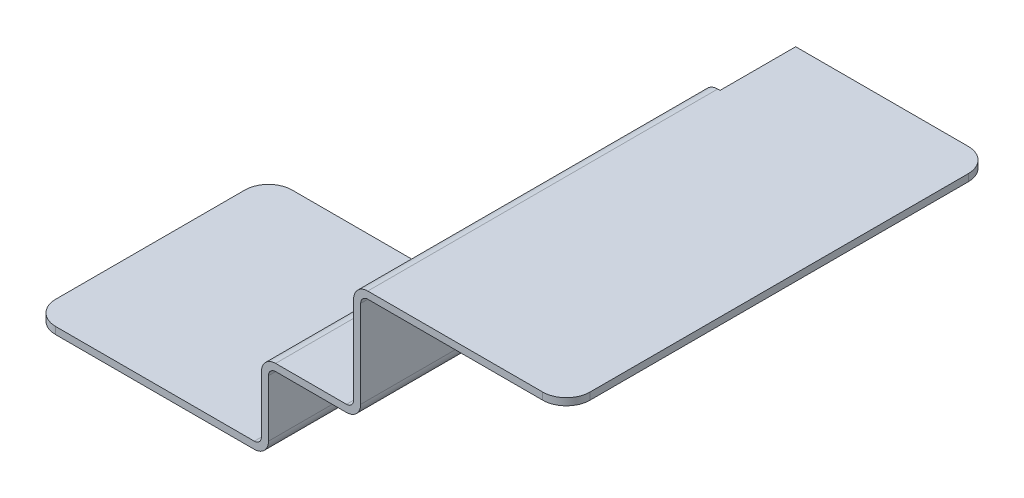
ISO-10303-21;
HEADER;
FILE_DESCRIPTION(('STEP AP214'),'2;1');
FILE_NAME('part.step','',(''),(''),'','','');
FILE_SCHEMA(('AUTOMOTIVE_DESIGN { 1 0 10303 214 1 1 1 1 }'));
ENDSEC;
DATA;
#1=APPLICATION_CONTEXT('core data for automotive mechanical design processes');
#2=APPLICATION_PROTOCOL_DEFINITION('international standard','automotive_design',2000,#1);
#3=PRODUCT_CONTEXT('',#1,'mechanical');
#4=PRODUCT('Part','Part','',(#3));
#5=PRODUCT_RELATED_PRODUCT_CATEGORY('part','',(#4));
#6=PRODUCT_DEFINITION_FORMATION('','',#4);
#7=PRODUCT_DEFINITION_CONTEXT('part definition',#1,'design');
#8=PRODUCT_DEFINITION('design','',#6,#7);
#9=PRODUCT_DEFINITION_SHAPE('','',#8);
#10=(LENGTH_UNIT() NAMED_UNIT(*) SI_UNIT(.MILLI.,.METRE.));
#11=(NAMED_UNIT(*) PLANE_ANGLE_UNIT() SI_UNIT($,.RADIAN.));
#12=(NAMED_UNIT(*) SI_UNIT($,.STERADIAN.) SOLID_ANGLE_UNIT());
#13=UNCERTAINTY_MEASURE_WITH_UNIT(LENGTH_MEASURE(1.E-05),#10,'distance_accuracy_value','');
#14=(GEOMETRIC_REPRESENTATION_CONTEXT(3) GLOBAL_UNCERTAINTY_ASSIGNED_CONTEXT((#13)) GLOBAL_UNIT_ASSIGNED_CONTEXT((#10,
#11,#12)) REPRESENTATION_CONTEXT('',''));
#15=CARTESIAN_POINT('',(0.,0.,0.));
#16=DIRECTION('',(0.,0.,1.));
#17=DIRECTION('',(1.,0.,0.));
#18=AXIS2_PLACEMENT_3D('',#15,#16,#17);
#19=CARTESIAN_POINT('',(50.,14.,16.));
#20=DIRECTION('',(0.,1.,0.));
#21=DIRECTION('',(0.,0.,1.));
#22=AXIS2_PLACEMENT_3D('',#19,#20,#21);
#23=PLANE('',#22);
#24=DIRECTION('',(0.,0.,-1.));
#25=VECTOR('',#24,1.);
#26=CARTESIAN_POINT('',(50.,14.,0.));
#27=LINE('',#26,#25);
#28=CARTESIAN_POINT('',(50.,14.,40.));
#29=VERTEX_POINT('',#28);
#30=CARTESIAN_POINT('',(50.,14.,16.));
#31=VERTEX_POINT('',#30);
#32=EDGE_CURVE('E309',#29,#31,#27,.T.);
#33=ORIENTED_EDGE('',*,*,#32,.F.);
#34=DIRECTION('',(1.,0.,0.));
#35=VECTOR('',#34,1.);
#36=CARTESIAN_POINT('',(25.2343965753023,14.,40.));
#37=LINE('',#36,#35);
#38=CARTESIAN_POINT('',(48.5,14.,40.));
#39=VERTEX_POINT('',#38);
#40=EDGE_CURVE('E196',#29,#39,#37,.F.);
#41=ORIENTED_EDGE('',*,*,#40,.T.);
#42=DIRECTION('',(0.,0.,1.));
#43=VECTOR('',#42,1.);
#44=CARTESIAN_POINT('',(48.5,14.,0.));
#45=LINE('',#44,#43);
#46=CARTESIAN_POINT('',(48.5,14.,16.));
#47=VERTEX_POINT('',#46);
#48=EDGE_CURVE('E272',#47,#39,#45,.T.);
#49=ORIENTED_EDGE('',*,*,#48,.F.);
#50=DIRECTION('',(1.,0.,0.));
#51=VECTOR('',#50,1.);
#52=CARTESIAN_POINT('',(48.5,14.,16.));
#53=LINE('',#52,#51);
#54=EDGE_CURVE('E207',#47,#31,#53,.T.);
#55=ORIENTED_EDGE('',*,*,#54,.T.);
#56=EDGE_LOOP('',(#33,#41,#49,#55));
#57=FACE_BOUND('',#56,.T.);
#58=ADVANCED_FACE('F17',(#57),#23,.F.);
#59=CARTESIAN_POINT('',(46.,7.5,60.));
#60=DIRECTION('',(1.,0.,0.));
#61=DIRECTION('',(0.,0.,-1.));
#62=AXIS2_PLACEMENT_3D('',#59,#60,#61);
#63=CYLINDRICAL_SURFACE('',#62,1.6);
#64=CARTESIAN_POINT('',(50.,7.5,60.));
#65=DIRECTION('',(1.,0.,0.));
#66=DIRECTION('',(0.,0.,-1.));
#67=AXIS2_PLACEMENT_3D('',#64,#65,#66);
#68=CIRCLE('',#67,1.6);
#69=CARTESIAN_POINT('',(50.,7.5,58.4));
#70=VERTEX_POINT('',#69);
#71=EDGE_CURVE('E302',#70,#70,#68,.F.);
#72=ORIENTED_EDGE('',*,*,#71,.F.);
#73=EDGE_LOOP('',(#72));
#74=FACE_BOUND('',#73,.T.);
#75=CARTESIAN_POINT('',(48.5,7.5,60.));
#76=DIRECTION('',(1.,0.,0.));
#77=DIRECTION('',(0.,0.,-1.));
#78=AXIS2_PLACEMENT_3D('',#75,#76,#77);
#79=CIRCLE('',#78,1.6);
#80=CARTESIAN_POINT('',(48.5,7.5,58.4));
#81=VERTEX_POINT('',#80);
#82=EDGE_CURVE('E263',#81,#81,#79,.T.);
#83=ORIENTED_EDGE('',*,*,#82,.F.);
#84=EDGE_LOOP('',(#83));
#85=FACE_BOUND('',#84,.T.);
#86=ADVANCED_FACE('F759',(#74,#85),#63,.F.);
#87=CARTESIAN_POINT('',(5.,9.72362012987013,85.));
#88=DIRECTION('',(0.,1.,0.));
#89=DIRECTION('',(-1.,0.,0.));
#90=AXIS2_PLACEMENT_3D('',#87,#88,#89);
#91=CYLINDRICAL_SURFACE('',#90,5.);
#92=CARTESIAN_POINT('',(5.,0.,85.));
#93=DIRECTION('',(0.,1.,0.));
#94=DIRECTION('',(-1.,0.,0.));
#95=AXIS2_PLACEMENT_3D('',#92,#93,#94);
#96=CIRCLE('',#95,5.);
#97=CARTESIAN_POINT('',(5.,0.,90.));
#98=VERTEX_POINT('',#97);
#99=CARTESIAN_POINT('',(0.,0.,85.));
#100=VERTEX_POINT('',#99);
#101=EDGE_CURVE('E20',#98,#100,#96,.F.);
#102=ORIENTED_EDGE('',*,*,#101,.F.);
#103=DIRECTION('',(0.,1.,0.));
#104=VECTOR('',#103,1.);
#105=CARTESIAN_POINT('',(5.,9.72362012987013,90.));
#106=LINE('',#105,#104);
#107=CARTESIAN_POINT('',(5.,1.5,90.));
#108=VERTEX_POINT('',#107);
#109=EDGE_CURVE('E185',#98,#108,#106,.T.);
#110=ORIENTED_EDGE('',*,*,#109,.T.);
#111=CARTESIAN_POINT('',(5.,1.5,85.));
#112=DIRECTION('',(0.,1.,0.));
#113=DIRECTION('',(-1.,0.,0.));
#114=AXIS2_PLACEMENT_3D('',#111,#112,#113);
#115=CIRCLE('',#114,5.);
#116=CARTESIAN_POINT('',(0.,1.5,85.));
#117=VERTEX_POINT('',#116);
#118=EDGE_CURVE('E259',#117,#108,#115,.T.);
#119=ORIENTED_EDGE('',*,*,#118,.F.);
#120=DIRECTION('',(0.,1.,0.));
#121=VECTOR('',#120,1.);
#122=CARTESIAN_POINT('',(0.,0.,85.));
#123=LINE('',#122,#121);
#124=EDGE_CURVE('E202',#100,#117,#123,.T.);
#125=ORIENTED_EDGE('',*,*,#124,.F.);
#126=EDGE_LOOP('',(#102,#110,#119,#125));
#127=FACE_BOUND('',#126,.T.);
#128=ADVANCED_FACE('F200',(#127),#91,.T.);
#129=CARTESIAN_POINT('',(25.2343965753023,0.829465188471263,40.));
#130=DIRECTION('',(0.,0.,1.));
#131=DIRECTION('',(1.,0.,0.));
#132=AXIS2_PLACEMENT_3D('',#129,#130,#131);
#133=PLANE('',#132);
#134=DIRECTION('',(1.,0.,0.));
#135=VECTOR('',#134,1.);
#136=CARTESIAN_POINT('',(0.,1.5,40.));
#137=LINE('',#136,#135);
#138=CARTESIAN_POINT('',(47.,1.5,40.));
#139=VERTEX_POINT('',#138);
#140=CARTESIAN_POINT('',(5.,1.5,40.));
#141=VERTEX_POINT('',#140);
#142=EDGE_CURVE('E253',#139,#141,#137,.F.);
#143=ORIENTED_EDGE('',*,*,#142,.F.);
#144=CARTESIAN_POINT('',(47.,3.,40.));
#145=DIRECTION('',(0.,0.,1.));
#146=DIRECTION('',(1.,0.,0.));
#147=AXIS2_PLACEMENT_3D('',#144,#145,#146);
#148=CIRCLE('',#147,1.5);
#149=CARTESIAN_POINT('',(48.5,3.,40.));
#150=VERTEX_POINT('',#149);
#151=EDGE_CURVE('E262',#139,#150,#148,.T.);
#152=ORIENTED_EDGE('',*,*,#151,.T.);
#153=DIRECTION('',(0.,1.,0.));
#154=VECTOR('',#153,1.);
#155=CARTESIAN_POINT('',(48.5,1.50000000000001,40.));
#156=LINE('',#155,#154);
#157=EDGE_CURVE('E268',#39,#150,#156,.F.);
#158=ORIENTED_EDGE('',*,*,#157,.F.);
#159=ORIENTED_EDGE('',*,*,#40,.F.);
#160=DIRECTION('',(0.,1.,0.));
#161=VECTOR('',#160,1.);
#162=CARTESIAN_POINT('',(50.,16.5,40.));
#163=LINE('',#162,#161);
#164=CARTESIAN_POINT('',(50.,3.,40.));
#165=VERTEX_POINT('',#164);
#166=EDGE_CURVE('E306',#165,#29,#163,.T.);
#167=ORIENTED_EDGE('',*,*,#166,.F.);
#168=CARTESIAN_POINT('',(47.,3.,40.));
#169=DIRECTION('',(0.,0.,1.));
#170=DIRECTION('',(1.,0.,0.));
#171=AXIS2_PLACEMENT_3D('',#168,#169,#170);
#172=CIRCLE('',#171,3.);
#173=CARTESIAN_POINT('',(47.,0.,40.));
#174=VERTEX_POINT('',#173);
#175=EDGE_CURVE('E310',#174,#165,#172,.T.);
#176=ORIENTED_EDGE('',*,*,#175,.F.);
#177=DIRECTION('',(1.,0.,0.));
#178=VECTOR('',#177,1.);
#179=CARTESIAN_POINT('',(50.,0.,40.));
#180=LINE('',#179,#178);
#181=CARTESIAN_POINT('',(5.,0.,40.));
#182=VERTEX_POINT('',#181);
#183=EDGE_CURVE('E311',#182,#174,#180,.T.);
#184=ORIENTED_EDGE('',*,*,#183,.F.);
#185=DIRECTION('',(0.,-1.,0.));
#186=VECTOR('',#185,1.);
#187=CARTESIAN_POINT('',(5.,0.414732594235629,40.));
#188=LINE('',#187,#186);
#189=EDGE_CURVE('E327',#141,#182,#188,.T.);
#190=ORIENTED_EDGE('',*,*,#189,.F.);
#191=EDGE_LOOP('',(#143,#152,#158,#159,#167,#176,#184,#190));
#192=FACE_BOUND('',#191,.T.);
#193=ADVANCED_FACE('F429',(#192),#133,.F.);
#194=CARTESIAN_POINT('',(5.,0.414732594235629,45.));
#195=DIRECTION('',(0.,-1.,0.));
#196=DIRECTION('',(1.,0.,0.));
#197=AXIS2_PLACEMENT_3D('',#194,#195,#196);
#198=CYLINDRICAL_SURFACE('',#197,5.);
#199=CARTESIAN_POINT('',(5.,1.5,45.));
#200=DIRECTION('',(0.,-1.,0.));
#201=DIRECTION('',(1.,0.,0.));
#202=AXIS2_PLACEMENT_3D('',#199,#200,#201);
#203=CIRCLE('',#202,5.);
#204=CARTESIAN_POINT('',(0.,1.5,45.));
#205=VERTEX_POINT('',#204);
#206=EDGE_CURVE('E252',#141,#205,#203,.F.);
#207=ORIENTED_EDGE('',*,*,#206,.F.);
#208=ORIENTED_EDGE('',*,*,#189,.T.);
#209=CARTESIAN_POINT('',(5.,0.,45.));
#210=DIRECTION('',(0.,-1.,0.));
#211=DIRECTION('',(1.,0.,0.));
#212=AXIS2_PLACEMENT_3D('',#209,#210,#211);
#213=CIRCLE('',#212,5.);
#214=CARTESIAN_POINT('',(0.,0.,45.));
#215=VERTEX_POINT('',#214);
#216=EDGE_CURVE('E313',#215,#182,#213,.T.);
#217=ORIENTED_EDGE('',*,*,#216,.F.);
#218=DIRECTION('',(0.,1.,0.));
#219=VECTOR('',#218,1.);
#220=CARTESIAN_POINT('',(0.,0.,45.));
#221=LINE('',#220,#219);
#222=EDGE_CURVE('E318',#205,#215,#221,.F.);
#223=ORIENTED_EDGE('',*,*,#222,.F.);
#224=EDGE_LOOP('',(#207,#208,#217,#223));
#225=FACE_BOUND('',#224,.T.);
#226=ADVANCED_FACE('F425',(#225),#198,.T.);
#227=CARTESIAN_POINT('',(0.,0.,0.));
#228=DIRECTION('',(-1.,0.,0.));
#229=DIRECTION('',(0.,0.,1.));
#230=AXIS2_PLACEMENT_3D('',#227,#228,#229);
#231=PLANE('',#230);
#232=ORIENTED_EDGE('',*,*,#222,.T.);
#233=DIRECTION('',(0.,0.,-1.));
#234=VECTOR('',#233,1.);
#235=CARTESIAN_POINT('',(0.,0.,0.));
#236=LINE('',#235,#234);
#237=EDGE_CURVE('E206',#100,#215,#236,.T.);
#238=ORIENTED_EDGE('',*,*,#237,.F.);
#239=ORIENTED_EDGE('',*,*,#124,.T.);
#240=DIRECTION('',(0.,0.,1.));
#241=VECTOR('',#240,1.);
#242=CARTESIAN_POINT('',(0.,1.5,0.));
#243=LINE('',#242,#241);
#244=EDGE_CURVE('E248',#205,#117,#243,.T.);
#245=ORIENTED_EDGE('',*,*,#244,.F.);
#246=EDGE_LOOP('',(#232,#238,#239,#245));
#247=FACE_BOUND('',#246,.T.);
#248=ADVANCED_FACE('F724',(#247),#231,.T.);
#249=CARTESIAN_POINT('',(48.5,14.,16.));
#250=DIRECTION('',(0.,0.,1.));
#251=DIRECTION('',(1.,0.,0.));
#252=AXIS2_PLACEMENT_3D('',#249,#250,#251);
#253=PLANE('',#252);
#254=CARTESIAN_POINT('',(71.,38.,16.));
#255=DIRECTION('',(0.,0.,1.));
#256=DIRECTION('',(1.,0.,0.));
#257=AXIS2_PLACEMENT_3D('',#254,#255,#256);
#258=CIRCLE('',#257,1.5);
#259=CARTESIAN_POINT('',(71.,39.5,16.));
#260=VERTEX_POINT('',#259);
#261=CARTESIAN_POINT('',(69.5,38.,16.));
#262=VERTEX_POINT('',#261);
#263=EDGE_CURVE('E286',#260,#262,#258,.T.);
#264=ORIENTED_EDGE('',*,*,#263,.T.);
#265=DIRECTION('',(0.,1.,0.));
#266=VECTOR('',#265,1.);
#267=CARTESIAN_POINT('',(69.5,39.5,16.));
#268=LINE('',#267,#266);
#269=CARTESIAN_POINT('',(69.5,19.5,16.));
#270=VERTEX_POINT('',#269);
#271=EDGE_CURVE('E290',#270,#262,#268,.T.);
#272=ORIENTED_EDGE('',*,*,#271,.F.);
#273=CARTESIAN_POINT('',(66.5,19.5,16.));
#274=DIRECTION('',(0.,0.,1.));
#275=DIRECTION('',(1.,0.,0.));
#276=AXIS2_PLACEMENT_3D('',#273,#274,#275);
#277=CIRCLE('',#276,3.);
#278=CARTESIAN_POINT('',(66.5,16.5,16.));
#279=VERTEX_POINT('',#278);
#280=EDGE_CURVE('E294',#279,#270,#277,.T.);
#281=ORIENTED_EDGE('',*,*,#280,.F.);
#282=DIRECTION('',(1.,0.,0.));
#283=VECTOR('',#282,1.);
#284=CARTESIAN_POINT('',(69.5,16.5,16.));
#285=LINE('',#284,#283);
#286=CARTESIAN_POINT('',(51.5,16.5,16.));
#287=VERTEX_POINT('',#286);
#288=EDGE_CURVE('E298',#287,#279,#285,.T.);
#289=ORIENTED_EDGE('',*,*,#288,.F.);
#290=CARTESIAN_POINT('',(51.5,15.,16.));
#291=DIRECTION('',(0.,0.,1.));
#292=DIRECTION('',(1.,0.,0.));
#293=AXIS2_PLACEMENT_3D('',#290,#291,#292);
#294=CIRCLE('',#293,1.5);
#295=CARTESIAN_POINT('',(50.,15.,16.));
#296=VERTEX_POINT('',#295);
#297=EDGE_CURVE('E301',#287,#296,#294,.T.);
#298=ORIENTED_EDGE('',*,*,#297,.T.);
#299=DIRECTION('',(0.,1.,0.));
#300=VECTOR('',#299,1.);
#301=CARTESIAN_POINT('',(50.,16.5,16.));
#302=LINE('',#301,#300);
#303=EDGE_CURVE('E307',#31,#296,#302,.T.);
#304=ORIENTED_EDGE('',*,*,#303,.F.);
#305=ORIENTED_EDGE('',*,*,#54,.F.);
#306=DIRECTION('',(0.,1.,0.));
#307=VECTOR('',#306,1.);
#308=CARTESIAN_POINT('',(48.5,1.50000000000001,16.));
#309=LINE('',#308,#307);
#310=CARTESIAN_POINT('',(48.5,15.,16.));
#311=VERTEX_POINT('',#310);
#312=EDGE_CURVE('E267',#311,#47,#309,.F.);
#313=ORIENTED_EDGE('',*,*,#312,.F.);
#314=CARTESIAN_POINT('',(51.5,15.,16.));
#315=DIRECTION('',(0.,0.,1.));
#316=DIRECTION('',(1.,0.,0.));
#317=AXIS2_PLACEMENT_3D('',#314,#315,#316);
#318=CIRCLE('',#317,3.);
#319=CARTESIAN_POINT('',(51.5,18.,16.));
#320=VERTEX_POINT('',#319);
#321=EDGE_CURVE('E273',#320,#311,#318,.T.);
#322=ORIENTED_EDGE('',*,*,#321,.F.);
#323=DIRECTION('',(1.,0.,0.));
#324=VECTOR('',#323,1.);
#325=CARTESIAN_POINT('',(48.5,18.,16.));
#326=LINE('',#325,#324);
#327=CARTESIAN_POINT('',(66.5,18.,16.));
#328=VERTEX_POINT('',#327);
#329=EDGE_CURVE('E277',#328,#320,#326,.F.);
#330=ORIENTED_EDGE('',*,*,#329,.F.);
#331=CARTESIAN_POINT('',(66.5,19.5,16.));
#332=DIRECTION('',(0.,0.,1.));
#333=DIRECTION('',(1.,0.,0.));
#334=AXIS2_PLACEMENT_3D('',#331,#332,#333);
#335=CIRCLE('',#334,1.5);
#336=CARTESIAN_POINT('',(68.,19.5,16.));
#337=VERTEX_POINT('',#336);
#338=EDGE_CURVE('E279',#328,#337,#335,.T.);
#339=ORIENTED_EDGE('',*,*,#338,.T.);
#340=DIRECTION('',(0.,1.,0.));
#341=VECTOR('',#340,1.);
#342=CARTESIAN_POINT('',(68.,18.,16.));
#343=LINE('',#342,#341);
#344=CARTESIAN_POINT('',(68.,38.,16.));
#345=VERTEX_POINT('',#344);
#346=EDGE_CURVE('E280',#345,#337,#343,.F.);
#347=ORIENTED_EDGE('',*,*,#346,.F.);
#348=CARTESIAN_POINT('',(71.,38.,16.));
#349=DIRECTION('',(0.,0.,1.));
#350=DIRECTION('',(1.,0.,0.));
#351=AXIS2_PLACEMENT_3D('',#348,#349,#350);
#352=CIRCLE('',#351,3.);
#353=CARTESIAN_POINT('',(71.,41.,16.));
#354=VERTEX_POINT('',#353);
#355=EDGE_CURVE('E218',#354,#345,#352,.T.);
#356=ORIENTED_EDGE('',*,*,#355,.F.);
#357=DIRECTION('',(1.,0.,0.));
#358=VECTOR('',#357,1.);
#359=CARTESIAN_POINT('',(48.5,41.,16.));
#360=LINE('',#359,#358);
#361=CARTESIAN_POINT('',(71.5,41.,16.));
#362=VERTEX_POINT('',#361);
#363=EDGE_CURVE('E316',#362,#354,#360,.F.);
#364=ORIENTED_EDGE('',*,*,#363,.F.);
#365=DIRECTION('',(0.,1.,0.));
#366=VECTOR('',#365,1.);
#367=CARTESIAN_POINT('',(71.5,40.372265982314,16.));
#368=LINE('',#367,#366);
#369=CARTESIAN_POINT('',(71.5,39.5,16.));
#370=VERTEX_POINT('',#369);
#371=EDGE_CURVE('E228',#362,#370,#368,.F.);
#372=ORIENTED_EDGE('',*,*,#371,.T.);
#373=DIRECTION('',(1.,0.,0.));
#374=VECTOR('',#373,1.);
#375=CARTESIAN_POINT('',(113.,39.5,16.));
#376=LINE('',#375,#374);
#377=EDGE_CURVE('E251',#260,#370,#376,.T.);
#378=ORIENTED_EDGE('',*,*,#377,.F.);
#379=EDGE_LOOP('',(#264,#272,#281,#289,#298,#304,#305,#313,#322,#330,#339,#347,#356,#364,#372,#378));
#380=FACE_BOUND('',#379,.T.);
#381=ADVANCED_FACE('F715',(#380),#253,.F.);
#382=CARTESIAN_POINT('',(50.,0.,0.));
#383=DIRECTION('',(0.,-1.,0.));
#384=DIRECTION('',(0.,0.,-1.));
#385=AXIS2_PLACEMENT_3D('',#382,#383,#384);
#386=PLANE('',#385);
#387=DIRECTION('',(0.,0.,1.));
#388=VECTOR('',#387,1.);
#389=CARTESIAN_POINT('',(47.,0.,45.));
#390=LINE('',#389,#388);
#391=CARTESIAN_POINT('',(47.,0.,90.));
#392=VERTEX_POINT('',#391);
#393=EDGE_CURVE('E211',#392,#174,#390,.F.);
#394=ORIENTED_EDGE('',*,*,#393,.F.);
#395=DIRECTION('',(1.,0.,0.));
#396=VECTOR('',#395,1.);
#397=CARTESIAN_POINT('',(57.5527597402597,0.,90.));
#398=LINE('',#397,#396);
#399=EDGE_CURVE('E191',#98,#392,#398,.T.);
#400=ORIENTED_EDGE('',*,*,#399,.F.);
#401=ORIENTED_EDGE('',*,*,#101,.T.);
#402=ORIENTED_EDGE('',*,*,#237,.T.);
#403=ORIENTED_EDGE('',*,*,#216,.T.);
#404=ORIENTED_EDGE('',*,*,#183,.T.);
#405=EDGE_LOOP('',(#394,#400,#401,#402,#403,#404));
#406=FACE_BOUND('',#405,.T.);
#407=ADVANCED_FACE('F208',(#406),#386,.T.);
#408=CARTESIAN_POINT('',(47.,3.,45.));
#409=DIRECTION('',(0.,0.,1.));
#410=DIRECTION('',(1.,0.,0.));
#411=AXIS2_PLACEMENT_3D('',#408,#409,#410);
#412=CYLINDRICAL_SURFACE('',#411,3.);
#413=CARTESIAN_POINT('',(47.,3.,90.));
#414=DIRECTION('',(0.,0.,1.));
#415=DIRECTION('',(1.,0.,0.));
#416=AXIS2_PLACEMENT_3D('',#413,#414,#415);
#417=CIRCLE('',#416,3.);
#418=CARTESIAN_POINT('',(50.,3.,90.));
#419=VERTEX_POINT('',#418);
#420=EDGE_CURVE('E213',#392,#419,#417,.T.);
#421=ORIENTED_EDGE('',*,*,#420,.F.);
#422=ORIENTED_EDGE('',*,*,#393,.T.);
#423=ORIENTED_EDGE('',*,*,#175,.T.);
#424=DIRECTION('',(0.,0.,-1.));
#425=VECTOR('',#424,1.);
#426=CARTESIAN_POINT('',(50.,3.,0.));
#427=LINE('',#426,#425);
#428=EDGE_CURVE('E303',#419,#165,#427,.T.);
#429=ORIENTED_EDGE('',*,*,#428,.F.);
#430=EDGE_LOOP('',(#421,#422,#423,#429));
#431=FACE_BOUND('',#430,.T.);
#432=ADVANCED_FACE('F433',(#431),#412,.T.);
#433=CARTESIAN_POINT('',(50.,16.5,0.));
#434=DIRECTION('',(1.,0.,0.));
#435=DIRECTION('',(0.,0.,-1.));
#436=AXIS2_PLACEMENT_3D('',#433,#434,#435);
#437=PLANE('',#436);
#438=ORIENTED_EDGE('',*,*,#71,.T.);
#439=EDGE_LOOP('',(#438));
#440=FACE_BOUND('',#439,.T.);
#441=ORIENTED_EDGE('',*,*,#428,.T.);
#442=ORIENTED_EDGE('',*,*,#166,.T.);
#443=ORIENTED_EDGE('',*,*,#32,.T.);
#444=ORIENTED_EDGE('',*,*,#303,.T.);
#445=DIRECTION('',(0.,0.,1.));
#446=VECTOR('',#445,1.);
#447=CARTESIAN_POINT('',(50.,15.,45.));
#448=LINE('',#447,#446);
#449=CARTESIAN_POINT('',(50.,15.,90.));
#450=VERTEX_POINT('',#449);
#451=EDGE_CURVE('E299',#296,#450,#448,.T.);
#452=ORIENTED_EDGE('',*,*,#451,.T.);
#453=DIRECTION('',(0.,1.,0.));
#454=VECTOR('',#453,1.);
#455=CARTESIAN_POINT('',(50.,19.4472402597403,90.));
#456=LINE('',#455,#454);
#457=EDGE_CURVE('E216',#419,#450,#456,.T.);
#458=ORIENTED_EDGE('',*,*,#457,.F.);
#459=EDGE_LOOP('',(#441,#442,#443,#444,#452,#458));
#460=FACE_BOUND('',#459,.T.);
#461=ADVANCED_FACE('F439',(#440,#460),#437,.T.);
#462=CARTESIAN_POINT('',(51.5,15.,45.));
#463=DIRECTION('',(0.,0.,1.));
#464=DIRECTION('',(1.,0.,0.));
#465=AXIS2_PLACEMENT_3D('',#462,#463,#464);
#466=CYLINDRICAL_SURFACE('',#465,1.5);
#467=DIRECTION('',(0.,0.,-1.));
#468=VECTOR('',#467,1.);
#469=CARTESIAN_POINT('',(51.5,16.5,0.));
#470=LINE('',#469,#468);
#471=CARTESIAN_POINT('',(51.5,16.5,90.));
#472=VERTEX_POINT('',#471);
#473=EDGE_CURVE('E295',#472,#287,#470,.T.);
#474=ORIENTED_EDGE('',*,*,#473,.F.);
#475=CARTESIAN_POINT('',(51.5,15.,90.));
#476=DIRECTION('',(0.,0.,1.));
#477=DIRECTION('',(1.,0.,0.));
#478=AXIS2_PLACEMENT_3D('',#475,#476,#477);
#479=CIRCLE('',#478,1.5);
#480=EDGE_CURVE('E397',#450,#472,#479,.F.);
#481=ORIENTED_EDGE('',*,*,#480,.F.);
#482=ORIENTED_EDGE('',*,*,#451,.F.);
#483=ORIENTED_EDGE('',*,*,#297,.F.);
#484=EDGE_LOOP('',(#474,#481,#482,#483));
#485=FACE_BOUND('',#484,.T.);
#486=ADVANCED_FACE('F444',(#485),#466,.F.);
#487=CARTESIAN_POINT('',(69.5,16.5,0.));
#488=DIRECTION('',(0.,-1.,0.));
#489=DIRECTION('',(0.,0.,-1.));
#490=AXIS2_PLACEMENT_3D('',#487,#488,#489);
#491=PLANE('',#490);
#492=DIRECTION('',(1.,0.,0.));
#493=VECTOR('',#492,1.);
#494=CARTESIAN_POINT('',(57.5527597402597,16.5,90.));
#495=LINE('',#494,#493);
#496=CARTESIAN_POINT('',(66.5,16.5,90.));
#497=VERTEX_POINT('',#496);
#498=EDGE_CURVE('E396',#472,#497,#495,.T.);
#499=ORIENTED_EDGE('',*,*,#498,.F.);
#500=ORIENTED_EDGE('',*,*,#473,.T.);
#501=ORIENTED_EDGE('',*,*,#288,.T.);
#502=DIRECTION('',(0.,0.,1.));
#503=VECTOR('',#502,1.);
#504=CARTESIAN_POINT('',(66.5,16.5,45.));
#505=LINE('',#504,#503);
#506=EDGE_CURVE('E291',#497,#279,#505,.F.);
#507=ORIENTED_EDGE('',*,*,#506,.F.);
#508=EDGE_LOOP('',(#499,#500,#501,#507));
#509=FACE_BOUND('',#508,.T.);
#510=ADVANCED_FACE('F447',(#509),#491,.T.);
#511=CARTESIAN_POINT('',(66.5,19.5,45.));
#512=DIRECTION('',(0.,0.,1.));
#513=DIRECTION('',(1.,0.,0.));
#514=AXIS2_PLACEMENT_3D('',#511,#512,#513);
#515=CYLINDRICAL_SURFACE('',#514,3.);
#516=CARTESIAN_POINT('',(66.5,19.5,90.));
#517=DIRECTION('',(0.,0.,1.));
#518=DIRECTION('',(1.,0.,0.));
#519=AXIS2_PLACEMENT_3D('',#516,#517,#518);
#520=CIRCLE('',#519,3.);
#521=CARTESIAN_POINT('',(69.5,19.5,90.));
#522=VERTEX_POINT('',#521);
#523=EDGE_CURVE('E393',#497,#522,#520,.T.);
#524=ORIENTED_EDGE('',*,*,#523,.F.);
#525=ORIENTED_EDGE('',*,*,#506,.T.);
#526=ORIENTED_EDGE('',*,*,#280,.T.);
#527=DIRECTION('',(0.,0.,-1.));
#528=VECTOR('',#527,1.);
#529=CARTESIAN_POINT('',(69.5,19.5,0.));
#530=LINE('',#529,#528);
#531=EDGE_CURVE('E287',#522,#270,#530,.T.);
#532=ORIENTED_EDGE('',*,*,#531,.F.);
#533=EDGE_LOOP('',(#524,#525,#526,#532));
#534=FACE_BOUND('',#533,.T.);
#535=ADVANCED_FACE('F663',(#534),#515,.T.);
#536=CARTESIAN_POINT('',(69.5,39.5,0.));
#537=DIRECTION('',(1.,0.,0.));
#538=DIRECTION('',(0.,0.,-1.));
#539=AXIS2_PLACEMENT_3D('',#536,#537,#538);
#540=PLANE('',#539);
#541=DIRECTION('',(0.,1.,0.));
#542=VECTOR('',#541,1.);
#543=CARTESIAN_POINT('',(69.5,19.4472402597403,90.));
#544=LINE('',#543,#542);
#545=CARTESIAN_POINT('',(69.5,38.,90.));
#546=VERTEX_POINT('',#545);
#547=EDGE_CURVE('E392',#522,#546,#544,.T.);
#548=ORIENTED_EDGE('',*,*,#547,.F.);
#549=ORIENTED_EDGE('',*,*,#531,.T.);
#550=ORIENTED_EDGE('',*,*,#271,.T.);
#551=DIRECTION('',(0.,0.,1.));
#552=VECTOR('',#551,1.);
#553=CARTESIAN_POINT('',(69.5,38.,45.));
#554=LINE('',#553,#552);
#555=EDGE_CURVE('E284',#262,#546,#554,.T.);
#556=ORIENTED_EDGE('',*,*,#555,.T.);
#557=EDGE_LOOP('',(#548,#549,#550,#556));
#558=FACE_BOUND('',#557,.T.);
#559=ADVANCED_FACE('F653',(#558),#540,.T.);
#560=CARTESIAN_POINT('',(71.,38.,45.));
#561=DIRECTION('',(0.,0.,1.));
#562=DIRECTION('',(1.,0.,0.));
#563=AXIS2_PLACEMENT_3D('',#560,#561,#562);
#564=CYLINDRICAL_SURFACE('',#563,1.5);
#565=DIRECTION('',(0.,0.,-1.));
#566=VECTOR('',#565,1.);
#567=CARTESIAN_POINT('',(71.,39.5,0.));
#568=LINE('',#567,#566);
#569=CARTESIAN_POINT('',(71.,39.5,90.));
#570=VERTEX_POINT('',#569);
#571=EDGE_CURVE('E232',#570,#260,#568,.T.);
#572=ORIENTED_EDGE('',*,*,#571,.F.);
#573=CARTESIAN_POINT('',(71.,38.,90.));
#574=DIRECTION('',(0.,0.,1.));
#575=DIRECTION('',(1.,0.,0.));
#576=AXIS2_PLACEMENT_3D('',#573,#574,#575);
#577=CIRCLE('',#576,1.5);
#578=EDGE_CURVE('E389',#546,#570,#577,.F.);
#579=ORIENTED_EDGE('',*,*,#578,.F.);
#580=ORIENTED_EDGE('',*,*,#555,.F.);
#581=ORIENTED_EDGE('',*,*,#263,.F.);
#582=EDGE_LOOP('',(#572,#579,#580,#581));
#583=FACE_BOUND('',#582,.T.);
#584=ADVANCED_FACE('F643',(#583),#564,.F.);
#585=CARTESIAN_POINT('',(68.,18.,0.));
#586=DIRECTION('',(-1.,0.,0.));
#587=DIRECTION('',(0.,0.,1.));
#588=AXIS2_PLACEMENT_3D('',#585,#586,#587);
#589=PLANE('',#588);
#590=DIRECTION('',(0.,1.,0.));
#591=VECTOR('',#590,1.);
#592=CARTESIAN_POINT('',(68.,19.4472402597403,90.));
#593=LINE('',#592,#591);
#594=CARTESIAN_POINT('',(68.,38.,90.));
#595=VERTEX_POINT('',#594);
#596=CARTESIAN_POINT('',(68.,19.5,90.));
#597=VERTEX_POINT('',#596);
#598=EDGE_CURVE('E384',#595,#597,#593,.F.);
#599=ORIENTED_EDGE('',*,*,#598,.F.);
#600=DIRECTION('',(0.,0.,1.));
#601=VECTOR('',#600,1.);
#602=CARTESIAN_POINT('',(68.,38.,45.));
#603=LINE('',#602,#601);
#604=EDGE_CURVE('E214',#345,#595,#603,.T.);
#605=ORIENTED_EDGE('',*,*,#604,.F.);
#606=ORIENTED_EDGE('',*,*,#346,.T.);
#607=DIRECTION('',(0.,0.,1.));
#608=VECTOR('',#607,1.);
#609=CARTESIAN_POINT('',(68.,19.5,45.));
#610=LINE('',#609,#608);
#611=EDGE_CURVE('E278',#337,#597,#610,.T.);
#612=ORIENTED_EDGE('',*,*,#611,.T.);
#613=EDGE_LOOP('',(#599,#605,#606,#612));
#614=FACE_BOUND('',#613,.T.);
#615=ADVANCED_FACE('F633',(#614),#589,.T.);
#616=CARTESIAN_POINT('',(66.5,19.5,45.));
#617=DIRECTION('',(0.,0.,1.));
#618=DIRECTION('',(1.,0.,0.));
#619=AXIS2_PLACEMENT_3D('',#616,#617,#618);
#620=CYLINDRICAL_SURFACE('',#619,1.5);
#621=DIRECTION('',(0.,0.,1.));
#622=VECTOR('',#621,1.);
#623=CARTESIAN_POINT('',(66.5,18.,0.));
#624=LINE('',#623,#622);
#625=CARTESIAN_POINT('',(66.5,18.,90.));
#626=VERTEX_POINT('',#625);
#627=EDGE_CURVE('E274',#626,#328,#624,.F.);
#628=ORIENTED_EDGE('',*,*,#627,.F.);
#629=CARTESIAN_POINT('',(66.5,19.5,90.));
#630=DIRECTION('',(0.,0.,1.));
#631=DIRECTION('',(1.,0.,0.));
#632=AXIS2_PLACEMENT_3D('',#629,#630,#631);
#633=CIRCLE('',#632,1.5);
#634=EDGE_CURVE('E381',#597,#626,#633,.F.);
#635=ORIENTED_EDGE('',*,*,#634,.F.);
#636=ORIENTED_EDGE('',*,*,#611,.F.);
#637=ORIENTED_EDGE('',*,*,#338,.F.);
#638=EDGE_LOOP('',(#628,#635,#636,#637));
#639=FACE_BOUND('',#638,.T.);
#640=ADVANCED_FACE('F623',(#639),#620,.F.);
#641=CARTESIAN_POINT('',(48.5,18.,0.));
#642=DIRECTION('',(0.,1.,0.));
#643=DIRECTION('',(0.,0.,1.));
#644=AXIS2_PLACEMENT_3D('',#641,#642,#643);
#645=PLANE('',#644);
#646=DIRECTION('',(1.,0.,0.));
#647=VECTOR('',#646,1.);
#648=CARTESIAN_POINT('',(57.5527597402597,18.,90.));
#649=LINE('',#648,#647);
#650=CARTESIAN_POINT('',(51.5,18.,90.));
#651=VERTEX_POINT('',#650);
#652=EDGE_CURVE('E380',#626,#651,#649,.F.);
#653=ORIENTED_EDGE('',*,*,#652,.F.);
#654=ORIENTED_EDGE('',*,*,#627,.T.);
#655=ORIENTED_EDGE('',*,*,#329,.T.);
#656=DIRECTION('',(0.,0.,1.));
#657=VECTOR('',#656,1.);
#658=CARTESIAN_POINT('',(51.5,18.,45.));
#659=LINE('',#658,#657);
#660=EDGE_CURVE('E269',#651,#320,#659,.F.);
#661=ORIENTED_EDGE('',*,*,#660,.F.);
#662=EDGE_LOOP('',(#653,#654,#655,#661));
#663=FACE_BOUND('',#662,.T.);
#664=ADVANCED_FACE('F613',(#663),#645,.T.);
#665=CARTESIAN_POINT('',(51.5,15.,45.));
#666=DIRECTION('',(0.,0.,1.));
#667=DIRECTION('',(1.,0.,0.));
#668=AXIS2_PLACEMENT_3D('',#665,#666,#667);
#669=CYLINDRICAL_SURFACE('',#668,3.);
#670=CARTESIAN_POINT('',(51.5,15.,90.));
#671=DIRECTION('',(0.,0.,1.));
#672=DIRECTION('',(1.,0.,0.));
#673=AXIS2_PLACEMENT_3D('',#670,#671,#672);
#674=CIRCLE('',#673,3.);
#675=CARTESIAN_POINT('',(48.5,15.,90.));
#676=VERTEX_POINT('',#675);
#677=EDGE_CURVE('E377',#651,#676,#674,.T.);
#678=ORIENTED_EDGE('',*,*,#677,.F.);
#679=ORIENTED_EDGE('',*,*,#660,.T.);
#680=ORIENTED_EDGE('',*,*,#321,.T.);
#681=DIRECTION('',(0.,0.,1.));
#682=VECTOR('',#681,1.);
#683=CARTESIAN_POINT('',(48.5,15.,0.));
#684=LINE('',#683,#682);
#685=EDGE_CURVE('E264',#676,#311,#684,.F.);
#686=ORIENTED_EDGE('',*,*,#685,.F.);
#687=EDGE_LOOP('',(#678,#679,#680,#686));
#688=FACE_BOUND('',#687,.T.);
#689=ADVANCED_FACE('F603',(#688),#669,.T.);
#690=CARTESIAN_POINT('',(48.5,1.50000000000001,0.));
#691=DIRECTION('',(-1.,0.,0.));
#692=DIRECTION('',(0.,0.,1.));
#693=AXIS2_PLACEMENT_3D('',#690,#691,#692);
#694=PLANE('',#693);
#695=ORIENTED_EDGE('',*,*,#82,.T.);
#696=EDGE_LOOP('',(#695));
#697=FACE_BOUND('',#696,.T.);
#698=ORIENTED_EDGE('',*,*,#685,.T.);
#699=ORIENTED_EDGE('',*,*,#312,.T.);
#700=ORIENTED_EDGE('',*,*,#48,.T.);
#701=ORIENTED_EDGE('',*,*,#157,.T.);
#702=DIRECTION('',(0.,0.,1.));
#703=VECTOR('',#702,1.);
#704=CARTESIAN_POINT('',(48.5,3.,45.));
#705=LINE('',#704,#703);
#706=CARTESIAN_POINT('',(48.5,3.,90.));
#707=VERTEX_POINT('',#706);
#708=EDGE_CURVE('E260',#150,#707,#705,.T.);
#709=ORIENTED_EDGE('',*,*,#708,.T.);
#710=DIRECTION('',(0.,1.,0.));
#711=VECTOR('',#710,1.);
#712=CARTESIAN_POINT('',(48.5,19.4472402597403,90.));
#713=LINE('',#712,#711);
#714=EDGE_CURVE('E376',#676,#707,#713,.F.);
#715=ORIENTED_EDGE('',*,*,#714,.F.);
#716=EDGE_LOOP('',(#698,#699,#700,#701,#709,#715));
#717=FACE_BOUND('',#716,.T.);
#718=ADVANCED_FACE('F593',(#697,#717),#694,.T.);
#719=CARTESIAN_POINT('',(47.,3.,45.));
#720=DIRECTION('',(0.,0.,1.));
#721=DIRECTION('',(1.,0.,0.));
#722=AXIS2_PLACEMENT_3D('',#719,#720,#721);
#723=CYLINDRICAL_SURFACE('',#722,1.5);
#724=DIRECTION('',(0.,0.,1.));
#725=VECTOR('',#724,1.);
#726=CARTESIAN_POINT('',(47.,1.5,0.));
#727=LINE('',#726,#725);
#728=CARTESIAN_POINT('',(47.,1.5,90.));
#729=VERTEX_POINT('',#728);
#730=EDGE_CURVE('E256',#729,#139,#727,.F.);
#731=ORIENTED_EDGE('',*,*,#730,.F.);
#732=CARTESIAN_POINT('',(47.,3.,90.));
#733=DIRECTION('',(0.,0.,1.));
#734=DIRECTION('',(1.,0.,0.));
#735=AXIS2_PLACEMENT_3D('',#732,#733,#734);
#736=CIRCLE('',#735,1.5);
#737=EDGE_CURVE('E374',#707,#729,#736,.F.);
#738=ORIENTED_EDGE('',*,*,#737,.F.);
#739=ORIENTED_EDGE('',*,*,#708,.F.);
#740=ORIENTED_EDGE('',*,*,#151,.F.);
#741=EDGE_LOOP('',(#731,#738,#739,#740));
#742=FACE_BOUND('',#741,.T.);
#743=ADVANCED_FACE('F583',(#742),#723,.F.);
#744=CARTESIAN_POINT('',(0.,1.5,0.));
#745=DIRECTION('',(0.,1.,0.));
#746=DIRECTION('',(0.,0.,1.));
#747=AXIS2_PLACEMENT_3D('',#744,#745,#746);
#748=PLANE('',#747);
#749=ORIENTED_EDGE('',*,*,#206,.T.);
#750=ORIENTED_EDGE('',*,*,#244,.T.);
#751=ORIENTED_EDGE('',*,*,#118,.T.);
#752=DIRECTION('',(1.,0.,0.));
#753=VECTOR('',#752,1.);
#754=CARTESIAN_POINT('',(57.5527597402597,1.5,90.));
#755=LINE('',#754,#753);
#756=EDGE_CURVE('E193',#729,#108,#755,.F.);
#757=ORIENTED_EDGE('',*,*,#756,.F.);
#758=ORIENTED_EDGE('',*,*,#730,.T.);
#759=ORIENTED_EDGE('',*,*,#142,.T.);
#760=EDGE_LOOP('',(#749,#750,#751,#757,#758,#759));
#761=FACE_BOUND('',#760,.T.);
#762=ADVANCED_FACE('F573',(#761),#748,.T.);
#763=CARTESIAN_POINT('',(113.,39.5,0.));
#764=DIRECTION('',(0.,-1.,0.));
#765=DIRECTION('',(0.,0.,-1.));
#766=AXIS2_PLACEMENT_3D('',#763,#764,#765);
#767=PLANE('',#766);
#768=DIRECTION('',(1.,0.,0.));
#769=VECTOR('',#768,1.);
#770=CARTESIAN_POINT('',(57.5527597402597,39.5,90.));
#771=LINE('',#770,#769);
#772=CARTESIAN_POINT('',(108.,39.5,90.));
#773=VERTEX_POINT('',#772);
#774=EDGE_CURVE('E388',#570,#773,#771,.T.);
#775=ORIENTED_EDGE('',*,*,#774,.F.);
#776=ORIENTED_EDGE('',*,*,#571,.T.);
#777=ORIENTED_EDGE('',*,*,#377,.T.);
#778=DIRECTION('',(0.,0.,-1.));
#779=VECTOR('',#778,1.);
#780=CARTESIAN_POINT('',(71.5,39.5,4.90914577525152));
#781=LINE('',#780,#779);
#782=CARTESIAN_POINT('',(71.5,39.5,0.));
#783=VERTEX_POINT('',#782);
#784=EDGE_CURVE('E231',#370,#783,#781,.T.);
#785=ORIENTED_EDGE('',*,*,#784,.T.);
#786=DIRECTION('',(1.,0.,0.));
#787=VECTOR('',#786,1.);
#788=CARTESIAN_POINT('',(57.5527597402597,39.5,0.));
#789=LINE('',#788,#787);
#790=CARTESIAN_POINT('',(108.,39.5,0.));
#791=VERTEX_POINT('',#790);
#792=EDGE_CURVE('E239',#783,#791,#789,.T.);
#793=ORIENTED_EDGE('',*,*,#792,.T.);
#794=CARTESIAN_POINT('',(108.,39.5,5.));
#795=DIRECTION('',(0.,1.,0.));
#796=DIRECTION('',(0.,0.,1.));
#797=AXIS2_PLACEMENT_3D('',#794,#795,#796);
#798=CIRCLE('',#797,5.);
#799=CARTESIAN_POINT('',(113.,39.5,5.));
#800=VERTEX_POINT('',#799);
#801=EDGE_CURVE('E241',#800,#791,#798,.T.);
#802=ORIENTED_EDGE('',*,*,#801,.F.);
#803=DIRECTION('',(0.,0.,-1.));
#804=VECTOR('',#803,1.);
#805=CARTESIAN_POINT('',(113.,39.5,0.));
#806=LINE('',#805,#804);
#807=CARTESIAN_POINT('',(113.,39.5,85.));
#808=VERTEX_POINT('',#807);
#809=EDGE_CURVE('E244',#808,#800,#806,.T.);
#810=ORIENTED_EDGE('',*,*,#809,.F.);
#811=CARTESIAN_POINT('',(108.,39.5,85.));
#812=DIRECTION('',(0.,-1.,0.));
#813=DIRECTION('',(0.,0.,-1.));
#814=AXIS2_PLACEMENT_3D('',#811,#812,#813);
#815=CIRCLE('',#814,5.);
#816=EDGE_CURVE('E371',#773,#808,#815,.F.);
#817=ORIENTED_EDGE('',*,*,#816,.F.);
#818=EDGE_LOOP('',(#775,#776,#777,#785,#793,#802,#810,#817));
#819=FACE_BOUND('',#818,.T.);
#820=ADVANCED_FACE('F563',(#819),#767,.T.);
#821=CARTESIAN_POINT('',(71.5,40.372265982314,4.90914577525152));
#822=DIRECTION('',(1.,0.,0.));
#823=DIRECTION('',(0.,0.,-1.));
#824=AXIS2_PLACEMENT_3D('',#821,#822,#823);
#825=PLANE('',#824);
#826=ORIENTED_EDGE('',*,*,#371,.F.);
#827=DIRECTION('',(0.,0.,1.));
#828=VECTOR('',#827,1.);
#829=CARTESIAN_POINT('',(71.5,41.,0.));
#830=LINE('',#829,#828);
#831=CARTESIAN_POINT('',(71.5,41.,0.));
#832=VERTEX_POINT('',#831);
#833=EDGE_CURVE('E227',#832,#362,#830,.T.);
#834=ORIENTED_EDGE('',*,*,#833,.F.);
#835=DIRECTION('',(0.,1.,0.));
#836=VECTOR('',#835,1.);
#837=CARTESIAN_POINT('',(71.5,19.4472402597403,0.));
#838=LINE('',#837,#836);
#839=EDGE_CURVE('E471',#832,#783,#838,.F.);
#840=ORIENTED_EDGE('',*,*,#839,.T.);
#841=ORIENTED_EDGE('',*,*,#784,.F.);
#842=EDGE_LOOP('',(#826,#834,#840,#841));
#843=FACE_BOUND('',#842,.T.);
#844=ADVANCED_FACE('F553',(#843),#825,.F.);
#845=CARTESIAN_POINT('',(71.,38.,45.));
#846=DIRECTION('',(0.,0.,1.));
#847=DIRECTION('',(1.,0.,0.));
#848=AXIS2_PLACEMENT_3D('',#845,#846,#847);
#849=CYLINDRICAL_SURFACE('',#848,3.);
#850=CARTESIAN_POINT('',(71.,38.,90.));
#851=DIRECTION('',(0.,0.,1.));
#852=DIRECTION('',(1.,0.,0.));
#853=AXIS2_PLACEMENT_3D('',#850,#851,#852);
#854=CIRCLE('',#853,3.);
#855=CARTESIAN_POINT('',(71.,41.,90.));
#856=VERTEX_POINT('',#855);
#857=EDGE_CURVE('E385',#856,#595,#854,.T.);
#858=ORIENTED_EDGE('',*,*,#857,.F.);
#859=DIRECTION('',(0.,0.,1.));
#860=VECTOR('',#859,1.);
#861=CARTESIAN_POINT('',(71.,41.,0.));
#862=LINE('',#861,#860);
#863=EDGE_CURVE('E223',#354,#856,#862,.T.);
#864=ORIENTED_EDGE('',*,*,#863,.F.);
#865=ORIENTED_EDGE('',*,*,#355,.T.);
#866=ORIENTED_EDGE('',*,*,#604,.T.);
#867=EDGE_LOOP('',(#858,#864,#865,#866));
#868=FACE_BOUND('',#867,.T.);
#869=ADVANCED_FACE('F544',(#868),#849,.T.);
#870=CARTESIAN_POINT('',(57.5527597402597,19.4472402597403,90.));
#871=DIRECTION('',(0.,0.,1.));
#872=DIRECTION('',(1.,0.,0.));
#873=AXIS2_PLACEMENT_3D('',#870,#871,#872);
#874=PLANE('',#873);
#875=ORIENTED_EDGE('',*,*,#737,.T.);
#876=ORIENTED_EDGE('',*,*,#756,.T.);
#877=ORIENTED_EDGE('',*,*,#109,.F.);
#878=ORIENTED_EDGE('',*,*,#399,.T.);
#879=ORIENTED_EDGE('',*,*,#420,.T.);
#880=ORIENTED_EDGE('',*,*,#457,.T.);
#881=ORIENTED_EDGE('',*,*,#480,.T.);
#882=ORIENTED_EDGE('',*,*,#498,.T.);
#883=ORIENTED_EDGE('',*,*,#523,.T.);
#884=ORIENTED_EDGE('',*,*,#547,.T.);
#885=ORIENTED_EDGE('',*,*,#578,.T.);
#886=ORIENTED_EDGE('',*,*,#774,.T.);
#887=DIRECTION('',(0.,-1.,0.));
#888=VECTOR('',#887,1.);
#889=CARTESIAN_POINT('',(108.,30.2236201298701,90.));
#890=LINE('',#889,#888);
#891=CARTESIAN_POINT('',(108.,41.,90.));
#892=VERTEX_POINT('',#891);
#893=EDGE_CURVE('E373',#892,#773,#890,.T.);
#894=ORIENTED_EDGE('',*,*,#893,.F.);
#895=DIRECTION('',(1.,0.,0.));
#896=VECTOR('',#895,1.);
#897=CARTESIAN_POINT('',(68.,41.,90.));
#898=LINE('',#897,#896);
#899=EDGE_CURVE('E226',#856,#892,#898,.T.);
#900=ORIENTED_EDGE('',*,*,#899,.F.);
#901=ORIENTED_EDGE('',*,*,#857,.T.);
#902=ORIENTED_EDGE('',*,*,#598,.T.);
#903=ORIENTED_EDGE('',*,*,#634,.T.);
#904=ORIENTED_EDGE('',*,*,#652,.T.);
#905=ORIENTED_EDGE('',*,*,#677,.T.);
#906=ORIENTED_EDGE('',*,*,#714,.T.);
#907=EDGE_LOOP('',(#875,#876,#877,#878,#879,#880,#881,#882,#883,#884,#885,#886,#894,#900,#901,
#902,#903,#904,#905,#906));
#908=FACE_BOUND('',#907,.T.);
#909=ADVANCED_FACE('F188',(#908),#874,.T.);
#910=CARTESIAN_POINT('',(108.,30.2236201298701,85.));
#911=DIRECTION('',(0.,-1.,0.));
#912=DIRECTION('',(0.,0.,-1.));
#913=AXIS2_PLACEMENT_3D('',#910,#911,#912);
#914=CYLINDRICAL_SURFACE('',#913,5.);
#915=CARTESIAN_POINT('',(108.,41.,85.));
#916=DIRECTION('',(0.,-1.,0.));
#917=DIRECTION('',(0.,0.,-1.));
#918=AXIS2_PLACEMENT_3D('',#915,#916,#917);
#919=CIRCLE('',#918,5.);
#920=CARTESIAN_POINT('',(113.,41.,85.));
#921=VERTEX_POINT('',#920);
#922=EDGE_CURVE('E367',#892,#921,#919,.F.);
#923=ORIENTED_EDGE('',*,*,#922,.F.);
#924=ORIENTED_EDGE('',*,*,#893,.T.);
#925=ORIENTED_EDGE('',*,*,#816,.T.);
#926=DIRECTION('',(0.,1.,0.));
#927=VECTOR('',#926,1.);
#928=CARTESIAN_POINT('',(113.,41.,85.));
#929=LINE('',#928,#927);
#930=EDGE_CURVE('E247',#921,#808,#929,.F.);
#931=ORIENTED_EDGE('',*,*,#930,.F.);
#932=EDGE_LOOP('',(#923,#924,#925,#931));
#933=FACE_BOUND('',#932,.T.);
#934=ADVANCED_FACE('F501',(#933),#914,.T.);
#935=CARTESIAN_POINT('',(113.,41.,0.));
#936=DIRECTION('',(1.,0.,0.));
#937=DIRECTION('',(0.,0.,-1.));
#938=AXIS2_PLACEMENT_3D('',#935,#936,#937);
#939=PLANE('',#938);
#940=ORIENTED_EDGE('',*,*,#930,.T.);
#941=ORIENTED_EDGE('',*,*,#809,.T.);
#942=DIRECTION('',(0.,1.,0.));
#943=VECTOR('',#942,1.);
#944=CARTESIAN_POINT('',(113.,30.2236201298701,5.));
#945=LINE('',#944,#943);
#946=CARTESIAN_POINT('',(113.,41.,5.));
#947=VERTEX_POINT('',#946);
#948=EDGE_CURVE('E246',#947,#800,#945,.F.);
#949=ORIENTED_EDGE('',*,*,#948,.F.);
#950=DIRECTION('',(0.,0.,1.));
#951=VECTOR('',#950,1.);
#952=CARTESIAN_POINT('',(113.,41.,0.));
#953=LINE('',#952,#951);
#954=EDGE_CURVE('E366',#921,#947,#953,.F.);
#955=ORIENTED_EDGE('',*,*,#954,.F.);
#956=EDGE_LOOP('',(#940,#941,#949,#955));
#957=FACE_BOUND('',#956,.T.);
#958=ADVANCED_FACE('F487',(#957),#939,.T.);
#959=CARTESIAN_POINT('',(108.,30.2236201298701,5.));
#960=DIRECTION('',(0.,1.,0.));
#961=DIRECTION('',(0.,0.,1.));
#962=AXIS2_PLACEMENT_3D('',#959,#960,#961);
#963=CYLINDRICAL_SURFACE('',#962,5.);
#964=ORIENTED_EDGE('',*,*,#801,.T.);
#965=DIRECTION('',(0.,1.,0.));
#966=VECTOR('',#965,1.);
#967=CARTESIAN_POINT('',(108.,19.4472402597403,0.));
#968=LINE('',#967,#966);
#969=CARTESIAN_POINT('',(108.,41.,0.));
#970=VERTEX_POINT('',#969);
#971=EDGE_CURVE('E35',#791,#970,#968,.T.);
#972=ORIENTED_EDGE('',*,*,#971,.T.);
#973=CARTESIAN_POINT('',(108.,41.,5.));
#974=DIRECTION('',(0.,1.,0.));
#975=DIRECTION('',(0.,0.,1.));
#976=AXIS2_PLACEMENT_3D('',#973,#974,#975);
#977=CIRCLE('',#976,5.);
#978=EDGE_CURVE('E26',#947,#970,#977,.T.);
#979=ORIENTED_EDGE('',*,*,#978,.F.);
#980=ORIENTED_EDGE('',*,*,#948,.T.);
#981=EDGE_LOOP('',(#964,#972,#979,#980));
#982=FACE_BOUND('',#981,.T.);
#983=ADVANCED_FACE('F490',(#982),#963,.T.);
#984=CARTESIAN_POINT('',(57.5527597402597,19.4472402597403,0.));
#985=DIRECTION('',(0.,0.,1.));
#986=DIRECTION('',(1.,0.,0.));
#987=AXIS2_PLACEMENT_3D('',#984,#985,#986);
#988=PLANE('',#987);
#989=DIRECTION('',(1.,0.,0.));
#990=VECTOR('',#989,1.);
#991=CARTESIAN_POINT('',(68.,41.,0.));
#992=LINE('',#991,#990);
#993=EDGE_CURVE('E11',#970,#832,#992,.F.);
#994=ORIENTED_EDGE('',*,*,#993,.F.);
#995=ORIENTED_EDGE('',*,*,#971,.F.);
#996=ORIENTED_EDGE('',*,*,#792,.F.);
#997=ORIENTED_EDGE('',*,*,#839,.F.);
#998=EDGE_LOOP('',(#994,#995,#996,#997));
#999=FACE_BOUND('',#998,.T.);
#1000=ADVANCED_FACE('F492',(#999),#988,.F.);
#1001=CARTESIAN_POINT('',(68.,41.,0.));
#1002=DIRECTION('',(0.,1.,0.));
#1003=DIRECTION('',(0.,0.,1.));
#1004=AXIS2_PLACEMENT_3D('',#1001,#1002,#1003);
#1005=PLANE('',#1004);
#1006=ORIENTED_EDGE('',*,*,#978,.T.);
#1007=ORIENTED_EDGE('',*,*,#993,.T.);
#1008=ORIENTED_EDGE('',*,*,#833,.T.);
#1009=ORIENTED_EDGE('',*,*,#363,.T.);
#1010=ORIENTED_EDGE('',*,*,#863,.T.);
#1011=ORIENTED_EDGE('',*,*,#899,.T.);
#1012=ORIENTED_EDGE('',*,*,#922,.T.);
#1013=ORIENTED_EDGE('',*,*,#954,.T.);
#1014=EDGE_LOOP('',(#1006,#1007,#1008,#1009,#1010,#1011,#1012,#1013));
#1015=FACE_BOUND('',#1014,.T.);
#1016=ADVANCED_FACE('F484',(#1015),#1005,.T.);
#1017=CLOSED_SHELL('',(#58,#86,#128,#193,#226,#248,#381,#407,#432,#461,#486,#510,#535,#559,#584,
#615,#640,#664,#689,#718,#743,#762,#820,#844,#869,#909,#934,#958,#983,#1000,#1016));
#1018=MANIFOLD_SOLID_BREP('B1',#1017);
#1019=ADVANCED_BREP_SHAPE_REPRESENTATION('',(#18,#1018),#14);
#1020=SHAPE_DEFINITION_REPRESENTATION(#9,#1019);
ENDSEC;
END-ISO-10303-21;
